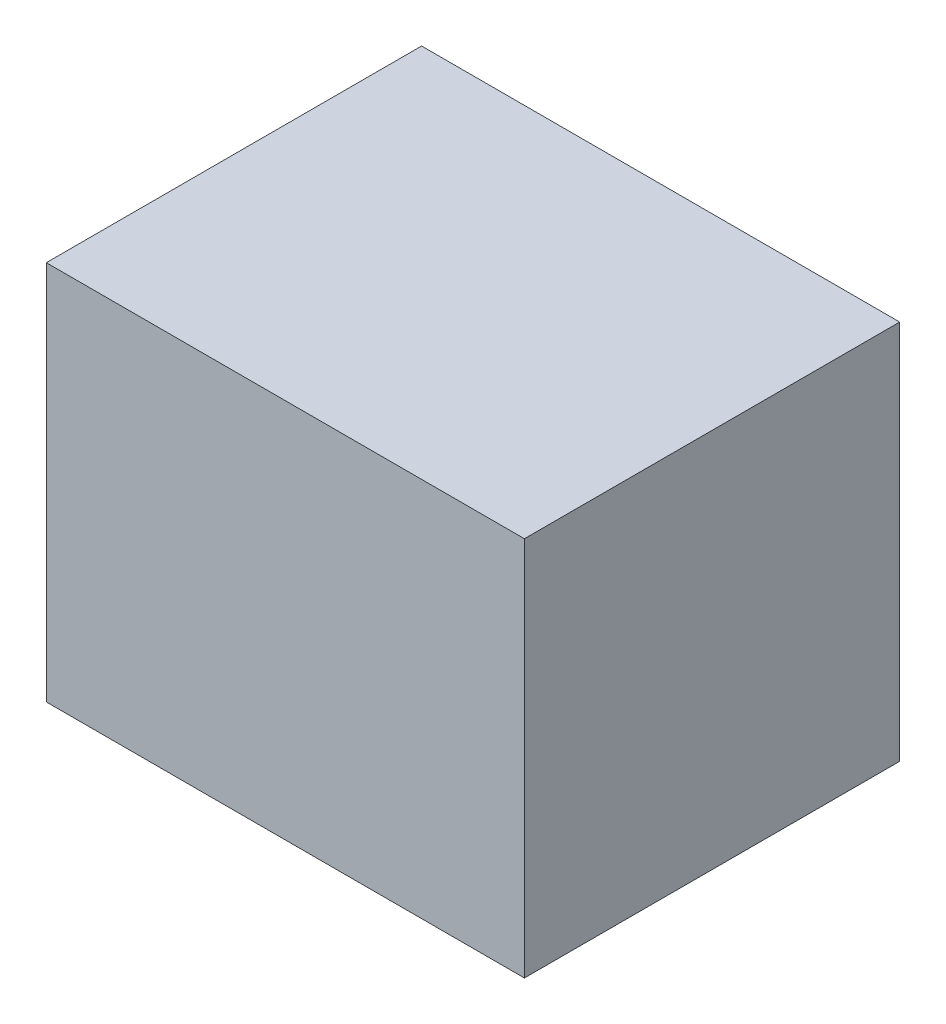
ISO-10303-21;
HEADER;
FILE_DESCRIPTION(('STEP AP214'),'2;1');
FILE_NAME('part.step','',(''),(''),'','','');
FILE_SCHEMA(('AUTOMOTIVE_DESIGN { 1 0 10303 214 1 1 1 1 }'));
ENDSEC;
DATA;
#1=APPLICATION_CONTEXT('core data for automotive mechanical design processes');
#2=APPLICATION_PROTOCOL_DEFINITION('international standard','automotive_design',2000,#1);
#3=PRODUCT_CONTEXT('',#1,'mechanical');
#4=PRODUCT('Part','Part','',(#3));
#5=PRODUCT_RELATED_PRODUCT_CATEGORY('part','',(#4));
#6=PRODUCT_DEFINITION_FORMATION('','',#4);
#7=PRODUCT_DEFINITION_CONTEXT('part definition',#1,'design');
#8=PRODUCT_DEFINITION('design','',#6,#7);
#9=PRODUCT_DEFINITION_SHAPE('','',#8);
#10=(LENGTH_UNIT() NAMED_UNIT(*) SI_UNIT(.MILLI.,.METRE.));
#11=(NAMED_UNIT(*) PLANE_ANGLE_UNIT() SI_UNIT($,.RADIAN.));
#12=(NAMED_UNIT(*) SI_UNIT($,.STERADIAN.) SOLID_ANGLE_UNIT());
#13=UNCERTAINTY_MEASURE_WITH_UNIT(LENGTH_MEASURE(1.E-05),#10,'distance_accuracy_value','');
#14=(GEOMETRIC_REPRESENTATION_CONTEXT(3) GLOBAL_UNCERTAINTY_ASSIGNED_CONTEXT((#13)) GLOBAL_UNIT_ASSIGNED_CONTEXT((#10,
#11,#12)) REPRESENTATION_CONTEXT('',''));
#15=CARTESIAN_POINT('',(0.,0.,0.));
#16=DIRECTION('',(0.,0.,1.));
#17=DIRECTION('',(1.,0.,0.));
#18=AXIS2_PLACEMENT_3D('',#15,#16,#17);
#19=CARTESIAN_POINT('',(46.5,-37.,36.5));
#20=DIRECTION('',(-1.,0.,0.));
#21=DIRECTION('',(0.,0.,1.));
#22=AXIS2_PLACEMENT_3D('',#19,#20,#21);
#23=PLANE('',#22);
#24=DIRECTION('',(0.,1.,0.));
#25=VECTOR('',#24,1.);
#26=CARTESIAN_POINT('',(46.5,-37.,-36.5));
#27=LINE('',#26,#25);
#28=CARTESIAN_POINT('',(46.5,-37.,-36.5));
#29=VERTEX_POINT('',#28);
#30=CARTESIAN_POINT('',(46.5,37.,-36.5));
#31=VERTEX_POINT('',#30);
#32=EDGE_CURVE('E96',#29,#31,#27,.T.);
#33=ORIENTED_EDGE('',*,*,#32,.T.);
#34=DIRECTION('',(0.,0.,-1.));
#35=VECTOR('',#34,1.);
#36=CARTESIAN_POINT('',(46.5,37.,36.5));
#37=LINE('',#36,#35);
#38=CARTESIAN_POINT('',(46.5,37.,36.5));
#39=VERTEX_POINT('',#38);
#40=EDGE_CURVE('E11',#39,#31,#37,.T.);
#41=ORIENTED_EDGE('',*,*,#40,.F.);
#42=DIRECTION('',(0.,1.,0.));
#43=VECTOR('',#42,1.);
#44=CARTESIAN_POINT('',(46.5,-37.,36.5));
#45=LINE('',#44,#43);
#46=CARTESIAN_POINT('',(46.5,-37.,36.5));
#47=VERTEX_POINT('',#46);
#48=EDGE_CURVE('E84',#47,#39,#45,.T.);
#49=ORIENTED_EDGE('',*,*,#48,.F.);
#50=DIRECTION('',(0.,0.,-1.));
#51=VECTOR('',#50,1.);
#52=CARTESIAN_POINT('',(46.5,-37.,36.5));
#53=LINE('',#52,#51);
#54=EDGE_CURVE('E92',#47,#29,#53,.T.);
#55=ORIENTED_EDGE('',*,*,#54,.T.);
#56=EDGE_LOOP('',(#33,#41,#49,#55));
#57=FACE_BOUND('',#56,.T.);
#58=ADVANCED_FACE('F33',(#57),#23,.F.);
#59=CARTESIAN_POINT('',(-46.5,37.,36.5));
#60=DIRECTION('',(0.,-1.,0.));
#61=DIRECTION('',(0.,0.,-1.));
#62=AXIS2_PLACEMENT_3D('',#59,#60,#61);
#63=PLANE('',#62);
#64=DIRECTION('',(-1.,0.,0.));
#65=VECTOR('',#64,1.);
#66=CARTESIAN_POINT('',(-46.5,37.,-36.5));
#67=LINE('',#66,#65);
#68=CARTESIAN_POINT('',(-46.5,37.,-36.5));
#69=VERTEX_POINT('',#68);
#70=EDGE_CURVE('E88',#31,#69,#67,.T.);
#71=ORIENTED_EDGE('',*,*,#70,.T.);
#72=DIRECTION('',(0.,0.,-1.));
#73=VECTOR('',#72,1.);
#74=CARTESIAN_POINT('',(-46.5,37.,36.5));
#75=LINE('',#74,#73);
#76=CARTESIAN_POINT('',(-46.5,37.,36.5));
#77=VERTEX_POINT('',#76);
#78=EDGE_CURVE('E41',#77,#69,#75,.T.);
#79=ORIENTED_EDGE('',*,*,#78,.F.);
#80=DIRECTION('',(-1.,0.,0.));
#81=VECTOR('',#80,1.);
#82=CARTESIAN_POINT('',(-46.5,37.,36.5));
#83=LINE('',#82,#81);
#84=EDGE_CURVE('E79',#39,#77,#83,.T.);
#85=ORIENTED_EDGE('',*,*,#84,.F.);
#86=ORIENTED_EDGE('',*,*,#40,.T.);
#87=EDGE_LOOP('',(#71,#79,#85,#86));
#88=FACE_BOUND('',#87,.T.);
#89=ADVANCED_FACE('F87',(#88),#63,.F.);
#90=CARTESIAN_POINT('',(-46.5,-37.,36.5));
#91=DIRECTION('',(1.,0.,0.));
#92=DIRECTION('',(0.,0.,-1.));
#93=AXIS2_PLACEMENT_3D('',#90,#91,#92);
#94=PLANE('',#93);
#95=DIRECTION('',(0.,-1.,0.));
#96=VECTOR('',#95,1.);
#97=CARTESIAN_POINT('',(-46.5,-37.,-36.5));
#98=LINE('',#97,#96);
#99=CARTESIAN_POINT('',(-46.5,-37.,-36.5));
#100=VERTEX_POINT('',#99);
#101=EDGE_CURVE('E66',#69,#100,#98,.T.);
#102=ORIENTED_EDGE('',*,*,#101,.T.);
#103=DIRECTION('',(0.,0.,-1.));
#104=VECTOR('',#103,1.);
#105=CARTESIAN_POINT('',(-46.5,-37.,36.5));
#106=LINE('',#105,#104);
#107=CARTESIAN_POINT('',(-46.5,-37.,36.5));
#108=VERTEX_POINT('',#107);
#109=EDGE_CURVE('E89',#108,#100,#106,.T.);
#110=ORIENTED_EDGE('',*,*,#109,.F.);
#111=DIRECTION('',(0.,-1.,0.));
#112=VECTOR('',#111,1.);
#113=CARTESIAN_POINT('',(-46.5,-37.,36.5));
#114=LINE('',#113,#112);
#115=EDGE_CURVE('E82',#77,#108,#114,.T.);
#116=ORIENTED_EDGE('',*,*,#115,.F.);
#117=ORIENTED_EDGE('',*,*,#78,.T.);
#118=EDGE_LOOP('',(#102,#110,#116,#117));
#119=FACE_BOUND('',#118,.T.);
#120=ADVANCED_FACE('F90',(#119),#94,.F.);
#121=CARTESIAN_POINT('',(-46.5,-37.,36.5));
#122=DIRECTION('',(0.,1.,0.));
#123=DIRECTION('',(0.,0.,1.));
#124=AXIS2_PLACEMENT_3D('',#121,#122,#123);
#125=PLANE('',#124);
#126=DIRECTION('',(1.,0.,0.));
#127=VECTOR('',#126,1.);
#128=CARTESIAN_POINT('',(-46.5,-37.,-36.5));
#129=LINE('',#128,#127);
#130=EDGE_CURVE('E72',#100,#29,#129,.T.);
#131=ORIENTED_EDGE('',*,*,#130,.T.);
#132=ORIENTED_EDGE('',*,*,#54,.F.);
#133=DIRECTION('',(1.,0.,0.));
#134=VECTOR('',#133,1.);
#135=CARTESIAN_POINT('',(-46.5,-37.,36.5));
#136=LINE('',#135,#134);
#137=EDGE_CURVE('E49',#108,#47,#136,.T.);
#138=ORIENTED_EDGE('',*,*,#137,.F.);
#139=ORIENTED_EDGE('',*,*,#109,.T.);
#140=EDGE_LOOP('',(#131,#132,#138,#139));
#141=FACE_BOUND('',#140,.T.);
#142=ADVANCED_FACE('F103',(#141),#125,.F.);
#143=CARTESIAN_POINT('',(0.,0.,36.5));
#144=DIRECTION('',(0.,0.,-1.));
#145=DIRECTION('',(-1.,0.,0.));
#146=AXIS2_PLACEMENT_3D('',#143,#144,#145);
#147=PLANE('',#146);
#148=ORIENTED_EDGE('',*,*,#48,.T.);
#149=ORIENTED_EDGE('',*,*,#84,.T.);
#150=ORIENTED_EDGE('',*,*,#115,.T.);
#151=ORIENTED_EDGE('',*,*,#137,.T.);
#152=EDGE_LOOP('',(#148,#149,#150,#151));
#153=FACE_BOUND('',#152,.T.);
#154=ADVANCED_FACE('F80',(#153),#147,.F.);
#155=CARTESIAN_POINT('',(0.,0.,-36.5));
#156=DIRECTION('',(0.,0.,-1.));
#157=DIRECTION('',(-1.,0.,0.));
#158=AXIS2_PLACEMENT_3D('',#155,#156,#157);
#159=PLANE('',#158);
#160=ORIENTED_EDGE('',*,*,#32,.F.);
#161=ORIENTED_EDGE('',*,*,#130,.F.);
#162=ORIENTED_EDGE('',*,*,#101,.F.);
#163=ORIENTED_EDGE('',*,*,#70,.F.);
#164=EDGE_LOOP('',(#160,#161,#162,#163));
#165=FACE_BOUND('',#164,.T.);
#166=ADVANCED_FACE('F106',(#165),#159,.T.);
#167=CLOSED_SHELL('',(#58,#89,#120,#142,#154,#166));
#168=MANIFOLD_SOLID_BREP('B2',#167);
#169=ADVANCED_BREP_SHAPE_REPRESENTATION('',(#18,#168),#14);
#170=SHAPE_DEFINITION_REPRESENTATION(#9,#169);
ENDSEC;
END-ISO-10303-21;
